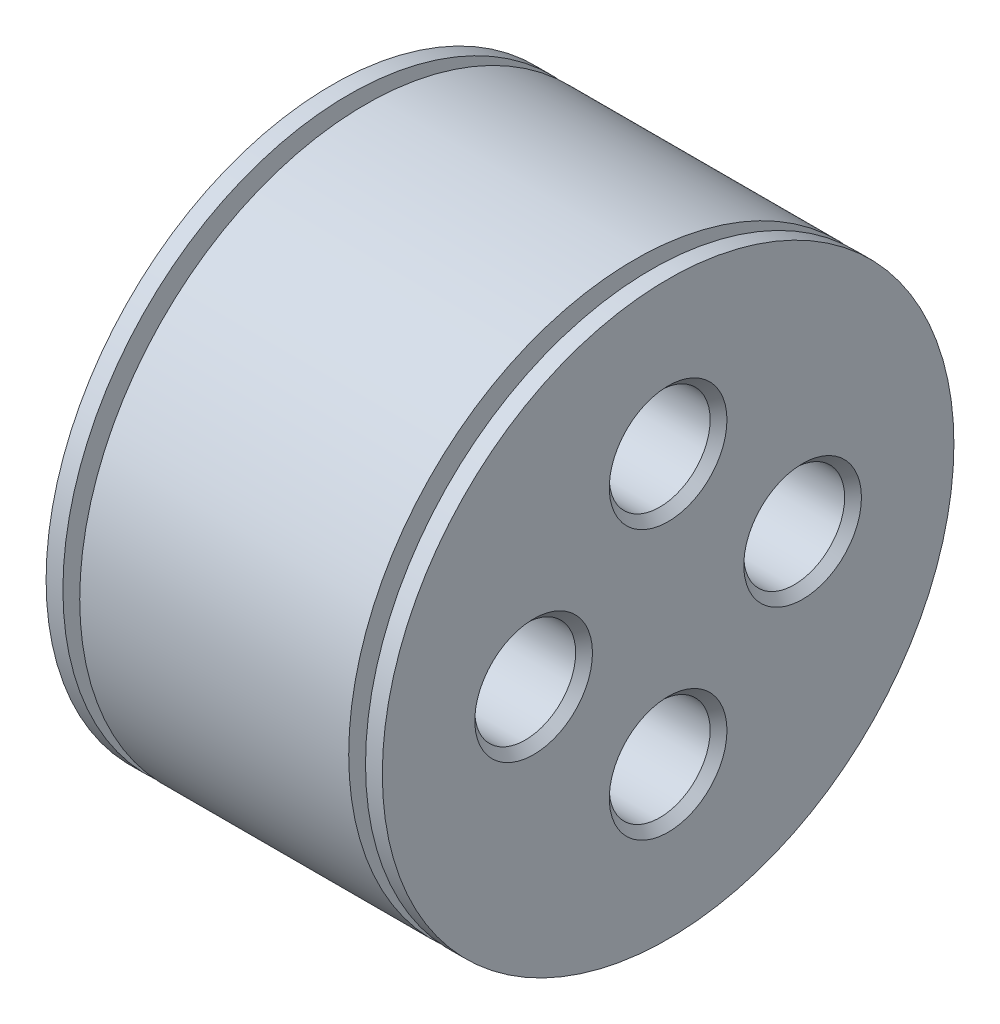
ISO-10303-21;
HEADER;
FILE_DESCRIPTION(('STEP AP214'),'2;1');
FILE_NAME('part.step','',(''),(''),'','','');
FILE_SCHEMA(('AUTOMOTIVE_DESIGN { 1 0 10303 214 1 1 1 1 }'));
ENDSEC;
DATA;
#1=APPLICATION_CONTEXT('core data for automotive mechanical design processes');
#2=APPLICATION_PROTOCOL_DEFINITION('international standard','automotive_design',2000,#1);
#3=PRODUCT_CONTEXT('',#1,'mechanical');
#4=PRODUCT('Part','Part','',(#3));
#5=PRODUCT_RELATED_PRODUCT_CATEGORY('part','',(#4));
#6=PRODUCT_DEFINITION_FORMATION('','',#4);
#7=PRODUCT_DEFINITION_CONTEXT('part definition',#1,'design');
#8=PRODUCT_DEFINITION('design','',#6,#7);
#9=PRODUCT_DEFINITION_SHAPE('','',#8);
#10=(LENGTH_UNIT() NAMED_UNIT(*) SI_UNIT(.MILLI.,.METRE.));
#11=(NAMED_UNIT(*) PLANE_ANGLE_UNIT() SI_UNIT($,.RADIAN.));
#12=(NAMED_UNIT(*) SI_UNIT($,.STERADIAN.) SOLID_ANGLE_UNIT());
#13=UNCERTAINTY_MEASURE_WITH_UNIT(LENGTH_MEASURE(1.E-05),#10,'distance_accuracy_value','');
#14=(GEOMETRIC_REPRESENTATION_CONTEXT(3) GLOBAL_UNCERTAINTY_ASSIGNED_CONTEXT((#13)) GLOBAL_UNIT_ASSIGNED_CONTEXT((#10,
#11,#12)) REPRESENTATION_CONTEXT('',''));
#15=CARTESIAN_POINT('',(0.,0.,0.));
#16=DIRECTION('',(0.,0.,1.));
#17=DIRECTION('',(1.,0.,0.));
#18=AXIS2_PLACEMENT_3D('',#15,#16,#17);
#19=CARTESIAN_POINT('',(20.,0.,-8.));
#20=DIRECTION('',(-1.,0.,0.));
#21=DIRECTION('',(0.,0.,1.));
#22=AXIS2_PLACEMENT_3D('',#19,#20,#21);
#23=CYLINDRICAL_SURFACE('',#22,1.5);
#24=CARTESIAN_POINT('',(6.,0.,-8.));
#25=DIRECTION('',(-1.,0.,0.));
#26=DIRECTION('',(0.,0.,1.));
#27=AXIS2_PLACEMENT_3D('',#24,#25,#26);
#28=CIRCLE('',#27,1.5);
#29=CARTESIAN_POINT('',(6.,0.,-6.5));
#30=VERTEX_POINT('',#29);
#31=EDGE_CURVE('E80',#30,#30,#28,.T.);
#32=ORIENTED_EDGE('',*,*,#31,.T.);
#33=EDGE_LOOP('',(#32));
#34=FACE_BOUND('',#33,.T.);
#35=CARTESIAN_POINT('',(15.,0.,-8.));
#36=DIRECTION('',(1.,0.,0.));
#37=DIRECTION('',(0.,0.,-1.));
#38=AXIS2_PLACEMENT_3D('',#35,#36,#37);
#39=CIRCLE('',#38,1.5);
#40=CARTESIAN_POINT('',(15.,0.,-9.5));
#41=VERTEX_POINT('',#40);
#42=EDGE_CURVE('E77',#41,#41,#39,.F.);
#43=ORIENTED_EDGE('',*,*,#42,.F.);
#44=EDGE_LOOP('',(#43));
#45=FACE_BOUND('',#44,.T.);
#46=ADVANCED_FACE('F43',(#34,#45),#23,.F.);
#47=CARTESIAN_POINT('',(20.,-8.,0.));
#48=DIRECTION('',(-1.,0.,0.));
#49=DIRECTION('',(0.,0.,1.));
#50=AXIS2_PLACEMENT_3D('',#47,#48,#49);
#51=CYLINDRICAL_SURFACE('',#50,1.5);
#52=CARTESIAN_POINT('',(6.,-8.,0.));
#53=DIRECTION('',(-1.,0.,0.));
#54=DIRECTION('',(0.,0.,1.));
#55=AXIS2_PLACEMENT_3D('',#52,#53,#54);
#56=CIRCLE('',#55,1.5);
#57=CARTESIAN_POINT('',(6.,-8.,1.5));
#58=VERTEX_POINT('',#57);
#59=EDGE_CURVE('E129',#58,#58,#56,.T.);
#60=ORIENTED_EDGE('',*,*,#59,.T.);
#61=EDGE_LOOP('',(#60));
#62=FACE_BOUND('',#61,.T.);
#63=CARTESIAN_POINT('',(15.,-8.,0.));
#64=DIRECTION('',(1.,0.,0.));
#65=DIRECTION('',(0.,0.,-1.));
#66=AXIS2_PLACEMENT_3D('',#63,#64,#65);
#67=CIRCLE('',#66,1.5);
#68=CARTESIAN_POINT('',(15.,-8.,-1.5));
#69=VERTEX_POINT('',#68);
#70=EDGE_CURVE('E81',#69,#69,#67,.F.);
#71=ORIENTED_EDGE('',*,*,#70,.F.);
#72=EDGE_LOOP('',(#71));
#73=FACE_BOUND('',#72,.T.);
#74=ADVANCED_FACE('F168',(#62,#73),#51,.F.);
#75=CARTESIAN_POINT('',(20.,0.,8.));
#76=DIRECTION('',(-1.,0.,0.));
#77=DIRECTION('',(0.,0.,1.));
#78=AXIS2_PLACEMENT_3D('',#75,#76,#77);
#79=CYLINDRICAL_SURFACE('',#78,1.5);
#80=CARTESIAN_POINT('',(6.,0.,8.));
#81=DIRECTION('',(-1.,0.,0.));
#82=DIRECTION('',(0.,0.,1.));
#83=AXIS2_PLACEMENT_3D('',#80,#81,#82);
#84=CIRCLE('',#83,1.5);
#85=CARTESIAN_POINT('',(6.,0.,9.5));
#86=VERTEX_POINT('',#85);
#87=EDGE_CURVE('E132',#86,#86,#84,.T.);
#88=ORIENTED_EDGE('',*,*,#87,.T.);
#89=EDGE_LOOP('',(#88));
#90=FACE_BOUND('',#89,.T.);
#91=CARTESIAN_POINT('',(15.,0.,8.));
#92=DIRECTION('',(1.,0.,0.));
#93=DIRECTION('',(0.,0.,-1.));
#94=AXIS2_PLACEMENT_3D('',#91,#92,#93);
#95=CIRCLE('',#94,1.5);
#96=CARTESIAN_POINT('',(15.,0.,6.5));
#97=VERTEX_POINT('',#96);
#98=EDGE_CURVE('E84',#97,#97,#95,.F.);
#99=ORIENTED_EDGE('',*,*,#98,.F.);
#100=EDGE_LOOP('',(#99));
#101=FACE_BOUND('',#100,.T.);
#102=ADVANCED_FACE('F174',(#90,#101),#79,.F.);
#103=CARTESIAN_POINT('',(20.,8.,0.));
#104=DIRECTION('',(-1.,0.,0.));
#105=DIRECTION('',(0.,0.,1.));
#106=AXIS2_PLACEMENT_3D('',#103,#104,#105);
#107=CYLINDRICAL_SURFACE('',#106,1.5);
#108=CARTESIAN_POINT('',(6.,8.,0.));
#109=DIRECTION('',(-1.,0.,0.));
#110=DIRECTION('',(0.,0.,1.));
#111=AXIS2_PLACEMENT_3D('',#108,#109,#110);
#112=CIRCLE('',#111,1.5);
#113=CARTESIAN_POINT('',(6.,8.,1.5));
#114=VERTEX_POINT('',#113);
#115=EDGE_CURVE('E124',#114,#114,#112,.T.);
#116=ORIENTED_EDGE('',*,*,#115,.T.);
#117=EDGE_LOOP('',(#116));
#118=FACE_BOUND('',#117,.T.);
#119=CARTESIAN_POINT('',(15.,8.,0.));
#120=DIRECTION('',(1.,0.,0.));
#121=DIRECTION('',(0.,0.,-1.));
#122=AXIS2_PLACEMENT_3D('',#119,#120,#121);
#123=CIRCLE('',#122,1.5);
#124=CARTESIAN_POINT('',(15.,8.,-1.5));
#125=VERTEX_POINT('',#124);
#126=EDGE_CURVE('E87',#125,#125,#123,.F.);
#127=ORIENTED_EDGE('',*,*,#126,.F.);
#128=EDGE_LOOP('',(#127));
#129=FACE_BOUND('',#128,.T.);
#130=ADVANCED_FACE('F232',(#118,#129),#107,.F.);
#131=CARTESIAN_POINT('',(1.,0.,0.));
#132=DIRECTION('',(-1.,0.,0.));
#133=DIRECTION('',(0.,0.,1.));
#134=AXIS2_PLACEMENT_3D('',#131,#132,#133);
#135=CYLINDRICAL_SURFACE('',#134,17.);
#136=CARTESIAN_POINT('',(1.,0.,0.));
#137=DIRECTION('',(1.,0.,0.));
#138=DIRECTION('',(0.,0.,-1.));
#139=AXIS2_PLACEMENT_3D('',#136,#137,#138);
#140=CIRCLE('',#139,17.);
#141=CARTESIAN_POINT('',(1.,0.,-17.));
#142=VERTEX_POINT('',#141);
#143=EDGE_CURVE('E94',#142,#142,#140,.T.);
#144=ORIENTED_EDGE('',*,*,#143,.F.);
#145=EDGE_LOOP('',(#144));
#146=FACE_BOUND('',#145,.T.);
#147=CARTESIAN_POINT('',(0.,0.,0.));
#148=DIRECTION('',(1.,0.,0.));
#149=DIRECTION('',(0.,0.,-1.));
#150=AXIS2_PLACEMENT_3D('',#147,#148,#149);
#151=CIRCLE('',#150,17.);
#152=CARTESIAN_POINT('',(0.,0.,-17.));
#153=VERTEX_POINT('',#152);
#154=EDGE_CURVE('E91',#153,#153,#151,.T.);
#155=ORIENTED_EDGE('',*,*,#154,.T.);
#156=EDGE_LOOP('',(#155));
#157=FACE_BOUND('',#156,.T.);
#158=ADVANCED_FACE('F225',(#146,#157),#135,.T.);
#159=CARTESIAN_POINT('',(1.,0.,0.));
#160=DIRECTION('',(1.,0.,0.));
#161=DIRECTION('',(0.,0.,-1.));
#162=AXIS2_PLACEMENT_3D('',#159,#160,#161);
#163=PLANE('',#162);
#164=CARTESIAN_POINT('',(1.,0.,0.));
#165=DIRECTION('',(1.,0.,0.));
#166=DIRECTION('',(0.,0.,-1.));
#167=AXIS2_PLACEMENT_3D('',#164,#165,#166);
#168=CIRCLE('',#167,15.);
#169=CARTESIAN_POINT('',(1.,0.,-15.));
#170=VERTEX_POINT('',#169);
#171=EDGE_CURVE('E98',#170,#170,#168,.T.);
#172=ORIENTED_EDGE('',*,*,#171,.F.);
#173=EDGE_LOOP('',(#172));
#174=FACE_BOUND('',#173,.T.);
#175=ORIENTED_EDGE('',*,*,#143,.T.);
#176=EDGE_LOOP('',(#175));
#177=FACE_BOUND('',#176,.T.);
#178=ADVANCED_FACE('F222',(#174,#177),#163,.T.);
#179=CARTESIAN_POINT('',(0.,0.,0.));
#180=DIRECTION('',(1.,0.,0.));
#181=DIRECTION('',(0.,0.,-1.));
#182=AXIS2_PLACEMENT_3D('',#179,#180,#181);
#183=PLANE('',#182);
#184=CARTESIAN_POINT('',(0.,0.,0.));
#185=DIRECTION('',(-1.,0.,0.));
#186=DIRECTION('',(0.,0.,1.));
#187=AXIS2_PLACEMENT_3D('',#184,#185,#186);
#188=CIRCLE('',#187,11.);
#189=CARTESIAN_POINT('',(0.,0.,11.));
#190=VERTEX_POINT('',#189);
#191=EDGE_CURVE('E121',#190,#190,#188,.T.);
#192=ORIENTED_EDGE('',*,*,#191,.F.);
#193=EDGE_LOOP('',(#192));
#194=FACE_BOUND('',#193,.T.);
#195=ORIENTED_EDGE('',*,*,#154,.F.);
#196=EDGE_LOOP('',(#195));
#197=FACE_BOUND('',#196,.T.);
#198=ADVANCED_FACE('F220',(#194,#197),#183,.F.);
#199=CARTESIAN_POINT('',(2.,0.,0.));
#200=DIRECTION('',(-1.,0.,0.));
#201=DIRECTION('',(0.,0.,1.));
#202=AXIS2_PLACEMENT_3D('',#199,#200,#201);
#203=CYLINDRICAL_SURFACE('',#202,15.);
#204=CARTESIAN_POINT('',(2.,0.,0.));
#205=DIRECTION('',(1.,0.,0.));
#206=DIRECTION('',(0.,0.,-1.));
#207=AXIS2_PLACEMENT_3D('',#204,#205,#206);
#208=CIRCLE('',#207,15.);
#209=CARTESIAN_POINT('',(2.,0.,-15.));
#210=VERTEX_POINT('',#209);
#211=EDGE_CURVE('E95',#210,#210,#208,.T.);
#212=ORIENTED_EDGE('',*,*,#211,.F.);
#213=EDGE_LOOP('',(#212));
#214=FACE_BOUND('',#213,.T.);
#215=ORIENTED_EDGE('',*,*,#171,.T.);
#216=EDGE_LOOP('',(#215));
#217=FACE_BOUND('',#216,.T.);
#218=ADVANCED_FACE('F216',(#214,#217),#203,.T.);
#219=CARTESIAN_POINT('',(18.,0.,0.));
#220=DIRECTION('',(-1.,0.,0.));
#221=DIRECTION('',(0.,0.,1.));
#222=AXIS2_PLACEMENT_3D('',#219,#220,#221);
#223=CYLINDRICAL_SURFACE('',#222,17.);
#224=CARTESIAN_POINT('',(18.,0.,0.));
#225=DIRECTION('',(1.,0.,0.));
#226=DIRECTION('',(0.,0.,-1.));
#227=AXIS2_PLACEMENT_3D('',#224,#225,#226);
#228=CIRCLE('',#227,17.);
#229=CARTESIAN_POINT('',(18.,0.,-17.));
#230=VERTEX_POINT('',#229);
#231=EDGE_CURVE('E103',#230,#230,#228,.T.);
#232=ORIENTED_EDGE('',*,*,#231,.F.);
#233=EDGE_LOOP('',(#232));
#234=FACE_BOUND('',#233,.T.);
#235=CARTESIAN_POINT('',(2.,0.,0.));
#236=DIRECTION('',(1.,0.,0.));
#237=DIRECTION('',(0.,0.,-1.));
#238=AXIS2_PLACEMENT_3D('',#235,#236,#237);
#239=CIRCLE('',#238,17.);
#240=CARTESIAN_POINT('',(2.,0.,-17.));
#241=VERTEX_POINT('',#240);
#242=EDGE_CURVE('E104',#241,#241,#239,.T.);
#243=ORIENTED_EDGE('',*,*,#242,.T.);
#244=EDGE_LOOP('',(#243));
#245=FACE_BOUND('',#244,.T.);
#246=ADVANCED_FACE('F209',(#234,#245),#223,.T.);
#247=CARTESIAN_POINT('',(18.,0.,0.));
#248=DIRECTION('',(1.,0.,0.));
#249=DIRECTION('',(0.,0.,-1.));
#250=AXIS2_PLACEMENT_3D('',#247,#248,#249);
#251=PLANE('',#250);
#252=CARTESIAN_POINT('',(18.,0.,0.));
#253=DIRECTION('',(1.,0.,0.));
#254=DIRECTION('',(0.,0.,-1.));
#255=AXIS2_PLACEMENT_3D('',#252,#253,#254);
#256=CIRCLE('',#255,13.);
#257=CARTESIAN_POINT('',(18.,0.,-13.));
#258=VERTEX_POINT('',#257);
#259=EDGE_CURVE('E76',#258,#258,#256,.T.);
#260=ORIENTED_EDGE('',*,*,#259,.F.);
#261=EDGE_LOOP('',(#260));
#262=FACE_BOUND('',#261,.T.);
#263=ORIENTED_EDGE('',*,*,#231,.T.);
#264=EDGE_LOOP('',(#263));
#265=FACE_BOUND('',#264,.T.);
#266=ADVANCED_FACE('F206',(#262,#265),#251,.T.);
#267=CARTESIAN_POINT('',(2.,0.,0.));
#268=DIRECTION('',(1.,0.,0.));
#269=DIRECTION('',(0.,0.,-1.));
#270=AXIS2_PLACEMENT_3D('',#267,#268,#269);
#271=PLANE('',#270);
#272=ORIENTED_EDGE('',*,*,#211,.T.);
#273=EDGE_LOOP('',(#272));
#274=FACE_BOUND('',#273,.T.);
#275=ORIENTED_EDGE('',*,*,#242,.F.);
#276=EDGE_LOOP('',(#275));
#277=FACE_BOUND('',#276,.T.);
#278=ADVANCED_FACE('F204',(#274,#277),#271,.F.);
#279=CARTESIAN_POINT('',(19.,0.,0.));
#280=DIRECTION('',(-1.,0.,0.));
#281=DIRECTION('',(0.,0.,1.));
#282=AXIS2_PLACEMENT_3D('',#279,#280,#281);
#283=CYLINDRICAL_SURFACE('',#282,13.);
#284=CARTESIAN_POINT('',(19.,0.,0.));
#285=DIRECTION('',(1.,0.,0.));
#286=DIRECTION('',(0.,0.,-1.));
#287=AXIS2_PLACEMENT_3D('',#284,#285,#286);
#288=CIRCLE('',#287,13.);
#289=CARTESIAN_POINT('',(19.,0.,-13.));
#290=VERTEX_POINT('',#289);
#291=EDGE_CURVE('E107',#290,#290,#288,.T.);
#292=ORIENTED_EDGE('',*,*,#291,.F.);
#293=EDGE_LOOP('',(#292));
#294=FACE_BOUND('',#293,.T.);
#295=ORIENTED_EDGE('',*,*,#259,.T.);
#296=EDGE_LOOP('',(#295));
#297=FACE_BOUND('',#296,.T.);
#298=ADVANCED_FACE('F200',(#294,#297),#283,.T.);
#299=CARTESIAN_POINT('',(20.,0.,0.));
#300=DIRECTION('',(-1.,0.,0.));
#301=DIRECTION('',(0.,0.,1.));
#302=AXIS2_PLACEMENT_3D('',#299,#300,#301);
#303=CYLINDRICAL_SURFACE('',#302,17.);
#304=CARTESIAN_POINT('',(20.,0.,0.));
#305=DIRECTION('',(1.,0.,0.));
#306=DIRECTION('',(0.,0.,-1.));
#307=AXIS2_PLACEMENT_3D('',#304,#305,#306);
#308=CIRCLE('',#307,17.);
#309=CARTESIAN_POINT('',(20.,0.,-17.));
#310=VERTEX_POINT('',#309);
#311=EDGE_CURVE('E114',#310,#310,#308,.T.);
#312=ORIENTED_EDGE('',*,*,#311,.F.);
#313=EDGE_LOOP('',(#312));
#314=FACE_BOUND('',#313,.T.);
#315=CARTESIAN_POINT('',(19.,0.,0.));
#316=DIRECTION('',(1.,0.,0.));
#317=DIRECTION('',(0.,0.,-1.));
#318=AXIS2_PLACEMENT_3D('',#315,#316,#317);
#319=CIRCLE('',#318,17.);
#320=CARTESIAN_POINT('',(19.,0.,-17.));
#321=VERTEX_POINT('',#320);
#322=EDGE_CURVE('E115',#321,#321,#319,.T.);
#323=ORIENTED_EDGE('',*,*,#322,.T.);
#324=EDGE_LOOP('',(#323));
#325=FACE_BOUND('',#324,.T.);
#326=ADVANCED_FACE('F193',(#314,#325),#303,.T.);
#327=CARTESIAN_POINT('',(20.,0.,0.));
#328=DIRECTION('',(1.,0.,0.));
#329=DIRECTION('',(0.,0.,-1.));
#330=AXIS2_PLACEMENT_3D('',#327,#328,#329);
#331=PLANE('',#330);
#332=CARTESIAN_POINT('',(20.,8.,0.));
#333=DIRECTION('',(1.,0.,0.));
#334=DIRECTION('',(0.,0.,-1.));
#335=AXIS2_PLACEMENT_3D('',#332,#333,#334);
#336=CIRCLE('',#335,3.50000000000002);
#337=CARTESIAN_POINT('',(20.,8.,-3.50000000000002));
#338=VERTEX_POINT('',#337);
#339=EDGE_CURVE('E59',#338,#338,#336,.F.);
#340=ORIENTED_EDGE('',*,*,#339,.T.);
#341=EDGE_LOOP('',(#340));
#342=FACE_BOUND('',#341,.T.);
#343=CARTESIAN_POINT('',(20.,0.,8.));
#344=DIRECTION('',(1.,0.,0.));
#345=DIRECTION('',(0.,0.,-1.));
#346=AXIS2_PLACEMENT_3D('',#343,#344,#345);
#347=CIRCLE('',#346,3.50000000000001);
#348=CARTESIAN_POINT('',(20.,0.,4.49999999999999));
#349=VERTEX_POINT('',#348);
#350=EDGE_CURVE('E64',#349,#349,#347,.F.);
#351=ORIENTED_EDGE('',*,*,#350,.T.);
#352=EDGE_LOOP('',(#351));
#353=FACE_BOUND('',#352,.T.);
#354=CARTESIAN_POINT('',(20.,0.,-8.));
#355=DIRECTION('',(1.,0.,0.));
#356=DIRECTION('',(0.,0.,-1.));
#357=AXIS2_PLACEMENT_3D('',#354,#355,#356);
#358=CIRCLE('',#357,3.50000000000001);
#359=CARTESIAN_POINT('',(20.,0.,-11.5));
#360=VERTEX_POINT('',#359);
#361=EDGE_CURVE('E67',#360,#360,#358,.F.);
#362=ORIENTED_EDGE('',*,*,#361,.T.);
#363=EDGE_LOOP('',(#362));
#364=FACE_BOUND('',#363,.T.);
#365=CARTESIAN_POINT('',(20.,-8.,0.));
#366=DIRECTION('',(1.,0.,0.));
#367=DIRECTION('',(0.,0.,-1.));
#368=AXIS2_PLACEMENT_3D('',#365,#366,#367);
#369=CIRCLE('',#368,3.50000000000001);
#370=CARTESIAN_POINT('',(20.,-8.,-3.50000000000001));
#371=VERTEX_POINT('',#370);
#372=EDGE_CURVE('E70',#371,#371,#369,.F.);
#373=ORIENTED_EDGE('',*,*,#372,.T.);
#374=EDGE_LOOP('',(#373));
#375=FACE_BOUND('',#374,.T.);
#376=ORIENTED_EDGE('',*,*,#311,.T.);
#377=EDGE_LOOP('',(#376));
#378=FACE_BOUND('',#377,.T.);
#379=ADVANCED_FACE('F190',(#342,#353,#364,#375,#378),#331,.T.);
#380=CARTESIAN_POINT('',(19.,0.,0.));
#381=DIRECTION('',(1.,0.,0.));
#382=DIRECTION('',(0.,0.,-1.));
#383=AXIS2_PLACEMENT_3D('',#380,#381,#382);
#384=PLANE('',#383);
#385=ORIENTED_EDGE('',*,*,#291,.T.);
#386=EDGE_LOOP('',(#385));
#387=FACE_BOUND('',#386,.T.);
#388=ORIENTED_EDGE('',*,*,#322,.F.);
#389=EDGE_LOOP('',(#388));
#390=FACE_BOUND('',#389,.T.);
#391=ADVANCED_FACE('F188',(#387,#390),#384,.F.);
#392=CARTESIAN_POINT('',(6.,0.,0.));
#393=DIRECTION('',(-1.,0.,0.));
#394=DIRECTION('',(0.,0.,1.));
#395=AXIS2_PLACEMENT_3D('',#392,#393,#394);
#396=CYLINDRICAL_SURFACE('',#395,11.);
#397=CARTESIAN_POINT('',(6.,0.,0.));
#398=DIRECTION('',(-1.,0.,0.));
#399=DIRECTION('',(0.,0.,1.));
#400=AXIS2_PLACEMENT_3D('',#397,#398,#399);
#401=CIRCLE('',#400,11.);
#402=CARTESIAN_POINT('',(6.,0.,11.));
#403=VERTEX_POINT('',#402);
#404=EDGE_CURVE('E118',#403,#403,#401,.T.);
#405=ORIENTED_EDGE('',*,*,#404,.F.);
#406=EDGE_LOOP('',(#405));
#407=FACE_BOUND('',#406,.T.);
#408=ORIENTED_EDGE('',*,*,#191,.T.);
#409=EDGE_LOOP('',(#408));
#410=FACE_BOUND('',#409,.T.);
#411=ADVANCED_FACE('F184',(#407,#410),#396,.F.);
#412=CARTESIAN_POINT('',(6.,0.,0.));
#413=DIRECTION('',(-1.,0.,0.));
#414=DIRECTION('',(0.,0.,1.));
#415=AXIS2_PLACEMENT_3D('',#412,#413,#414);
#416=PLANE('',#415);
#417=ORIENTED_EDGE('',*,*,#115,.F.);
#418=EDGE_LOOP('',(#417));
#419=FACE_BOUND('',#418,.T.);
#420=ORIENTED_EDGE('',*,*,#87,.F.);
#421=EDGE_LOOP('',(#420));
#422=FACE_BOUND('',#421,.T.);
#423=ORIENTED_EDGE('',*,*,#59,.F.);
#424=EDGE_LOOP('',(#423));
#425=FACE_BOUND('',#424,.T.);
#426=ORIENTED_EDGE('',*,*,#31,.F.);
#427=EDGE_LOOP('',(#426));
#428=FACE_BOUND('',#427,.T.);
#429=ORIENTED_EDGE('',*,*,#404,.T.);
#430=EDGE_LOOP('',(#429));
#431=FACE_BOUND('',#430,.T.);
#432=ADVANCED_FACE('F180',(#419,#422,#425,#428,#431),#416,.T.);
#433=CARTESIAN_POINT('',(15.,8.,0.));
#434=DIRECTION('',(1.,0.,0.));
#435=DIRECTION('',(0.,0.,-1.));
#436=AXIS2_PLACEMENT_3D('',#433,#434,#435);
#437=PLANE('',#436);
#438=CARTESIAN_POINT('',(15.,8.,0.));
#439=DIRECTION('',(1.,0.,0.));
#440=DIRECTION('',(0.,0.,-1.));
#441=AXIS2_PLACEMENT_3D('',#438,#439,#440);
#442=CIRCLE('',#441,3.);
#443=CARTESIAN_POINT('',(15.,8.,-3.));
#444=VERTEX_POINT('',#443);
#445=EDGE_CURVE('E143',#444,#444,#442,.T.);
#446=ORIENTED_EDGE('',*,*,#445,.T.);
#447=EDGE_LOOP('',(#446));
#448=FACE_BOUND('',#447,.T.);
#449=ORIENTED_EDGE('',*,*,#126,.T.);
#450=EDGE_LOOP('',(#449));
#451=FACE_BOUND('',#450,.T.);
#452=ADVANCED_FACE('F183',(#448,#451),#437,.T.);
#453=CARTESIAN_POINT('',(15.,8.,0.));
#454=DIRECTION('',(1.,0.,0.));
#455=DIRECTION('',(0.,0.,-1.));
#456=AXIS2_PLACEMENT_3D('',#453,#454,#455);
#457=CYLINDRICAL_SURFACE('',#456,3.);
#458=CARTESIAN_POINT('',(19.5,8.,0.));
#459=DIRECTION('',(1.,0.,0.));
#460=DIRECTION('',(0.,0.,-1.));
#461=AXIS2_PLACEMENT_3D('',#458,#459,#460);
#462=CIRCLE('',#461,3.);
#463=CARTESIAN_POINT('',(19.5,8.,-3.));
#464=VERTEX_POINT('',#463);
#465=EDGE_CURVE('E73',#464,#464,#462,.T.);
#466=ORIENTED_EDGE('',*,*,#465,.T.);
#467=EDGE_LOOP('',(#466));
#468=FACE_BOUND('',#467,.T.);
#469=ORIENTED_EDGE('',*,*,#445,.F.);
#470=EDGE_LOOP('',(#469));
#471=FACE_BOUND('',#470,.T.);
#472=ADVANCED_FACE('F164',(#468,#471),#457,.F.);
#473=CARTESIAN_POINT('',(15.,0.,8.));
#474=DIRECTION('',(1.,0.,0.));
#475=DIRECTION('',(0.,0.,-1.));
#476=AXIS2_PLACEMENT_3D('',#473,#474,#475);
#477=PLANE('',#476);
#478=CARTESIAN_POINT('',(15.,0.,8.));
#479=DIRECTION('',(1.,0.,0.));
#480=DIRECTION('',(0.,0.,-1.));
#481=AXIS2_PLACEMENT_3D('',#478,#479,#480);
#482=CIRCLE('',#481,3.);
#483=CARTESIAN_POINT('',(15.,0.,5.));
#484=VERTEX_POINT('',#483);
#485=EDGE_CURVE('E90',#484,#484,#482,.T.);
#486=ORIENTED_EDGE('',*,*,#485,.T.);
#487=EDGE_LOOP('',(#486));
#488=FACE_BOUND('',#487,.T.);
#489=ORIENTED_EDGE('',*,*,#98,.T.);
#490=EDGE_LOOP('',(#489));
#491=FACE_BOUND('',#490,.T.);
#492=ADVANCED_FACE('F149',(#488,#491),#477,.T.);
#493=CARTESIAN_POINT('',(15.,0.,8.));
#494=DIRECTION('',(1.,0.,0.));
#495=DIRECTION('',(0.,0.,-1.));
#496=AXIS2_PLACEMENT_3D('',#493,#494,#495);
#497=CYLINDRICAL_SURFACE('',#496,3.);
#498=CARTESIAN_POINT('',(19.5,0.,8.));
#499=DIRECTION('',(1.,0.,0.));
#500=DIRECTION('',(0.,0.,-1.));
#501=AXIS2_PLACEMENT_3D('',#498,#499,#500);
#502=CIRCLE('',#501,3.);
#503=CARTESIAN_POINT('',(19.5,0.,5.));
#504=VERTEX_POINT('',#503);
#505=EDGE_CURVE('E55',#504,#504,#502,.T.);
#506=ORIENTED_EDGE('',*,*,#505,.T.);
#507=EDGE_LOOP('',(#506));
#508=FACE_BOUND('',#507,.T.);
#509=ORIENTED_EDGE('',*,*,#485,.F.);
#510=EDGE_LOOP('',(#509));
#511=FACE_BOUND('',#510,.T.);
#512=ADVANCED_FACE('F152',(#508,#511),#497,.F.);
#513=CARTESIAN_POINT('',(15.,-8.,0.));
#514=DIRECTION('',(1.,0.,0.));
#515=DIRECTION('',(0.,0.,-1.));
#516=AXIS2_PLACEMENT_3D('',#513,#514,#515);
#517=PLANE('',#516);
#518=CARTESIAN_POINT('',(15.,-8.,0.));
#519=DIRECTION('',(1.,0.,0.));
#520=DIRECTION('',(0.,0.,-1.));
#521=AXIS2_PLACEMENT_3D('',#518,#519,#520);
#522=CIRCLE('',#521,3.);
#523=CARTESIAN_POINT('',(15.,-8.,-3.));
#524=VERTEX_POINT('',#523);
#525=EDGE_CURVE('E137',#524,#524,#522,.T.);
#526=ORIENTED_EDGE('',*,*,#525,.T.);
#527=EDGE_LOOP('',(#526));
#528=FACE_BOUND('',#527,.T.);
#529=ORIENTED_EDGE('',*,*,#70,.T.);
#530=EDGE_LOOP('',(#529));
#531=FACE_BOUND('',#530,.T.);
#532=ADVANCED_FACE('F154',(#528,#531),#517,.T.);
#533=CARTESIAN_POINT('',(15.,-8.,0.));
#534=DIRECTION('',(1.,0.,0.));
#535=DIRECTION('',(0.,0.,-1.));
#536=AXIS2_PLACEMENT_3D('',#533,#534,#535);
#537=CYLINDRICAL_SURFACE('',#536,3.);
#538=CARTESIAN_POINT('',(19.5,-8.,0.));
#539=DIRECTION('',(1.,0.,0.));
#540=DIRECTION('',(0.,0.,-1.));
#541=AXIS2_PLACEMENT_3D('',#538,#539,#540);
#542=CIRCLE('',#541,3.);
#543=CARTESIAN_POINT('',(19.5,-8.,-3.));
#544=VERTEX_POINT('',#543);
#545=EDGE_CURVE('E10',#544,#544,#542,.T.);
#546=ORIENTED_EDGE('',*,*,#545,.T.);
#547=EDGE_LOOP('',(#546));
#548=FACE_BOUND('',#547,.T.);
#549=ORIENTED_EDGE('',*,*,#525,.F.);
#550=EDGE_LOOP('',(#549));
#551=FACE_BOUND('',#550,.T.);
#552=ADVANCED_FACE('F161',(#548,#551),#537,.F.);
#553=CARTESIAN_POINT('',(15.,0.,-8.));
#554=DIRECTION('',(1.,0.,0.));
#555=DIRECTION('',(0.,0.,-1.));
#556=AXIS2_PLACEMENT_3D('',#553,#554,#555);
#557=PLANE('',#556);
#558=CARTESIAN_POINT('',(15.,0.,-8.));
#559=DIRECTION('',(1.,0.,0.));
#560=DIRECTION('',(0.,0.,-1.));
#561=AXIS2_PLACEMENT_3D('',#558,#559,#560);
#562=CIRCLE('',#561,3.);
#563=CARTESIAN_POINT('',(15.,0.,-11.));
#564=VERTEX_POINT('',#563);
#565=EDGE_CURVE('E140',#564,#564,#562,.T.);
#566=ORIENTED_EDGE('',*,*,#565,.T.);
#567=EDGE_LOOP('',(#566));
#568=FACE_BOUND('',#567,.T.);
#569=ORIENTED_EDGE('',*,*,#42,.T.);
#570=EDGE_LOOP('',(#569));
#571=FACE_BOUND('',#570,.T.);
#572=ADVANCED_FACE('F296',(#568,#571),#557,.T.);
#573=CARTESIAN_POINT('',(15.,0.,-8.));
#574=DIRECTION('',(1.,0.,0.));
#575=DIRECTION('',(0.,0.,-1.));
#576=AXIS2_PLACEMENT_3D('',#573,#574,#575);
#577=CYLINDRICAL_SURFACE('',#576,3.);
#578=CARTESIAN_POINT('',(19.5,0.,-8.));
#579=DIRECTION('',(1.,0.,0.));
#580=DIRECTION('',(0.,0.,-1.));
#581=AXIS2_PLACEMENT_3D('',#578,#579,#580);
#582=CIRCLE('',#581,3.);
#583=CARTESIAN_POINT('',(19.5,0.,-11.));
#584=VERTEX_POINT('',#583);
#585=EDGE_CURVE('E51',#584,#584,#582,.T.);
#586=ORIENTED_EDGE('',*,*,#585,.T.);
#587=EDGE_LOOP('',(#586));
#588=FACE_BOUND('',#587,.T.);
#589=ORIENTED_EDGE('',*,*,#565,.F.);
#590=EDGE_LOOP('',(#589));
#591=FACE_BOUND('',#590,.T.);
#592=ADVANCED_FACE('F242',(#588,#591),#577,.F.);
#593=CARTESIAN_POINT('',(19.5,8.,0.));
#594=DIRECTION('',(1.,0.,0.));
#595=DIRECTION('',(0.,0.,-1.));
#596=AXIS2_PLACEMENT_3D('',#593,#594,#595);
#597=CONICAL_SURFACE('',#596,3.,0.785398163397451);
#598=ORIENTED_EDGE('',*,*,#339,.F.);
#599=EDGE_LOOP('',(#598));
#600=FACE_BOUND('',#599,.T.);
#601=ORIENTED_EDGE('',*,*,#465,.F.);
#602=EDGE_LOOP('',(#601));
#603=FACE_BOUND('',#602,.T.);
#604=ADVANCED_FACE('F235',(#600,#603),#597,.F.);
#605=CARTESIAN_POINT('',(19.5,0.,8.));
#606=DIRECTION('',(1.,0.,0.));
#607=DIRECTION('',(0.,0.,-1.));
#608=AXIS2_PLACEMENT_3D('',#605,#606,#607);
#609=CONICAL_SURFACE('',#608,3.,0.785398163397453);
#610=ORIENTED_EDGE('',*,*,#350,.F.);
#611=EDGE_LOOP('',(#610));
#612=FACE_BOUND('',#611,.T.);
#613=ORIENTED_EDGE('',*,*,#505,.F.);
#614=EDGE_LOOP('',(#613));
#615=FACE_BOUND('',#614,.T.);
#616=ADVANCED_FACE('F241',(#612,#615),#609,.F.);
#617=CARTESIAN_POINT('',(19.5,0.,-8.));
#618=DIRECTION('',(1.,0.,0.));
#619=DIRECTION('',(0.,0.,-1.));
#620=AXIS2_PLACEMENT_3D('',#617,#618,#619);
#621=CONICAL_SURFACE('',#620,3.,0.785398163397453);
#622=ORIENTED_EDGE('',*,*,#361,.F.);
#623=EDGE_LOOP('',(#622));
#624=FACE_BOUND('',#623,.T.);
#625=ORIENTED_EDGE('',*,*,#585,.F.);
#626=EDGE_LOOP('',(#625));
#627=FACE_BOUND('',#626,.T.);
#628=ADVANCED_FACE('F248',(#624,#627),#621,.F.);
#629=CARTESIAN_POINT('',(19.5,-8.,0.));
#630=DIRECTION('',(1.,0.,0.));
#631=DIRECTION('',(0.,0.,-1.));
#632=AXIS2_PLACEMENT_3D('',#629,#630,#631);
#633=CONICAL_SURFACE('',#632,3.,0.785398163397451);
#634=ORIENTED_EDGE('',*,*,#372,.F.);
#635=EDGE_LOOP('',(#634));
#636=FACE_BOUND('',#635,.T.);
#637=ORIENTED_EDGE('',*,*,#545,.F.);
#638=EDGE_LOOP('',(#637));
#639=FACE_BOUND('',#638,.T.);
#640=ADVANCED_FACE('F46',(#636,#639),#633,.F.);
#641=CLOSED_SHELL('',(#46,#74,#102,#130,#158,#178,#198,#218,#246,#266,#278,#298,#326,#379,#391,
#411,#432,#452,#472,#492,#512,#532,#552,#572,#592,#604,#616,#628,#640));
#642=MANIFOLD_SOLID_BREP('B2',#641);
#643=ADVANCED_BREP_SHAPE_REPRESENTATION('',(#18,#642),#14);
#644=SHAPE_DEFINITION_REPRESENTATION(#9,#643);
ENDSEC;
END-ISO-10303-21;
